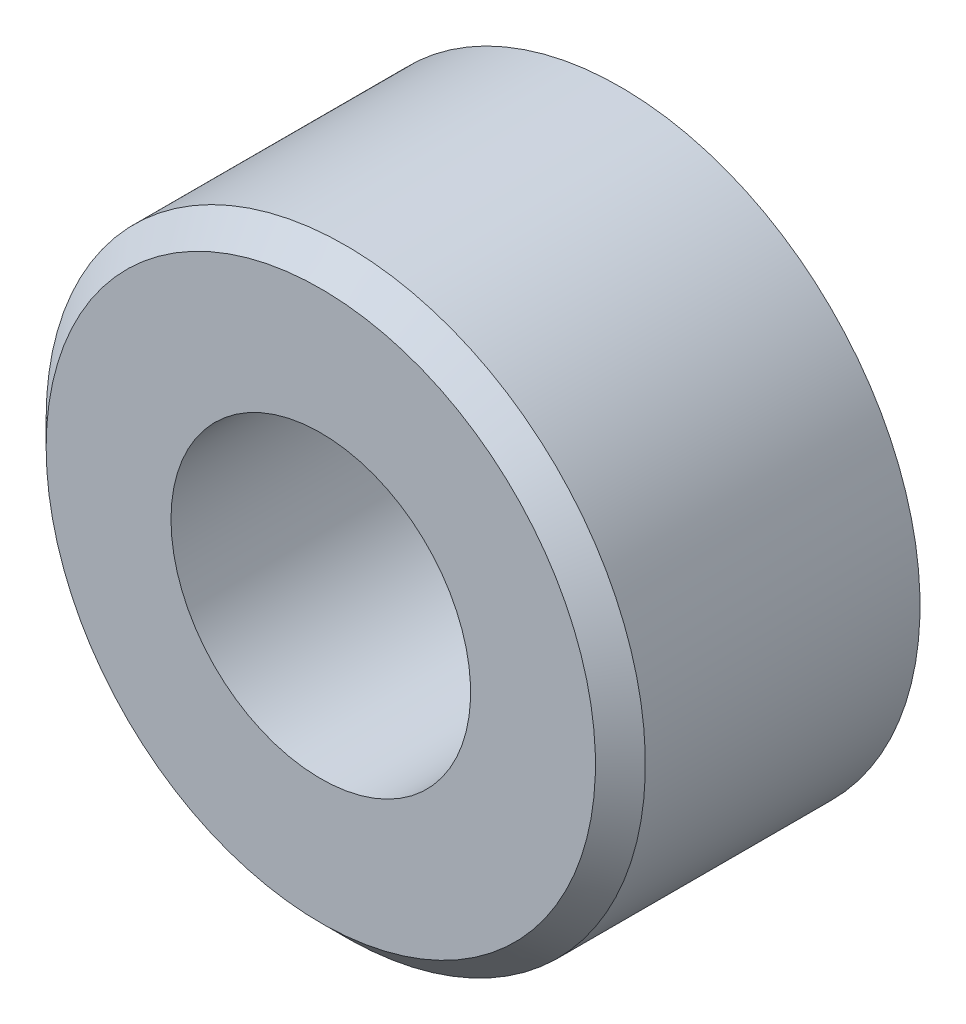
ISO-10303-21;
HEADER;
FILE_DESCRIPTION(('STEP AP214'),'2;1');
FILE_NAME('part.step','',(''),(''),'','','');
FILE_SCHEMA(('AUTOMOTIVE_DESIGN { 1 0 10303 214 1 1 1 1 }'));
ENDSEC;
DATA;
#1=APPLICATION_CONTEXT('core data for automotive mechanical design processes');
#2=APPLICATION_PROTOCOL_DEFINITION('international standard','automotive_design',2000,#1);
#3=PRODUCT_CONTEXT('',#1,'mechanical');
#4=PRODUCT('Part','Part','',(#3));
#5=PRODUCT_RELATED_PRODUCT_CATEGORY('part','',(#4));
#6=PRODUCT_DEFINITION_FORMATION('','',#4);
#7=PRODUCT_DEFINITION_CONTEXT('part definition',#1,'design');
#8=PRODUCT_DEFINITION('design','',#6,#7);
#9=PRODUCT_DEFINITION_SHAPE('','',#8);
#10=(LENGTH_UNIT() NAMED_UNIT(*) SI_UNIT(.MILLI.,.METRE.));
#11=(NAMED_UNIT(*) PLANE_ANGLE_UNIT() SI_UNIT($,.RADIAN.));
#12=(NAMED_UNIT(*) SI_UNIT($,.STERADIAN.) SOLID_ANGLE_UNIT());
#13=UNCERTAINTY_MEASURE_WITH_UNIT(LENGTH_MEASURE(1.E-05),#10,'distance_accuracy_value','');
#14=(GEOMETRIC_REPRESENTATION_CONTEXT(3) GLOBAL_UNCERTAINTY_ASSIGNED_CONTEXT((#13)) GLOBAL_UNIT_ASSIGNED_CONTEXT((#10,
#11,#12)) REPRESENTATION_CONTEXT('',''));
#15=CARTESIAN_POINT('',(0.,0.,0.));
#16=DIRECTION('',(0.,0.,1.));
#17=DIRECTION('',(1.,0.,0.));
#18=AXIS2_PLACEMENT_3D('',#15,#16,#17);
#19=CARTESIAN_POINT('',(5.5,0.,6.));
#20=DIRECTION('',(0.,0.,1.));
#21=DIRECTION('',(1.,0.,0.));
#22=AXIS2_PLACEMENT_3D('',#19,#20,#21);
#23=PLANE('',#22);
#24=CARTESIAN_POINT('',(0.,0.,6.));
#25=DIRECTION('',(0.,0.,-1.));
#26=DIRECTION('',(-1.,0.,0.));
#27=AXIS2_PLACEMENT_3D('',#24,#25,#26);
#28=CIRCLE('',#27,3.);
#29=CARTESIAN_POINT('',(-3.,0.,6.));
#30=VERTEX_POINT('',#29);
#31=EDGE_CURVE('E10',#30,#30,#28,.T.);
#32=ORIENTED_EDGE('',*,*,#31,.T.);
#33=EDGE_LOOP('',(#32));
#34=FACE_BOUND('',#33,.T.);
#35=CARTESIAN_POINT('',(0.,0.,6.));
#36=DIRECTION('',(0.,0.,-1.));
#37=DIRECTION('',(-1.,0.,0.));
#38=AXIS2_PLACEMENT_3D('',#35,#36,#37);
#39=CIRCLE('',#38,5.5);
#40=CARTESIAN_POINT('',(-5.5,0.,6.));
#41=VERTEX_POINT('',#40);
#42=EDGE_CURVE('E52',#41,#41,#39,.T.);
#43=ORIENTED_EDGE('',*,*,#42,.F.);
#44=EDGE_LOOP('',(#43));
#45=FACE_BOUND('',#44,.T.);
#46=ADVANCED_FACE('F33',(#34,#45),#23,.T.);
#47=CARTESIAN_POINT('',(0.,0.,6.));
#48=DIRECTION('',(0.,0.,-1.));
#49=DIRECTION('',(-1.,0.,0.));
#50=AXIS2_PLACEMENT_3D('',#47,#48,#49);
#51=CYLINDRICAL_SURFACE('',#50,3.);
#52=CARTESIAN_POINT('',(0.,0.,0.));
#53=DIRECTION('',(0.,0.,-1.));
#54=DIRECTION('',(-1.,0.,0.));
#55=AXIS2_PLACEMENT_3D('',#52,#53,#54);
#56=CIRCLE('',#55,3.);
#57=CARTESIAN_POINT('',(-3.,0.,0.));
#58=VERTEX_POINT('',#57);
#59=EDGE_CURVE('E39',#58,#58,#56,.T.);
#60=ORIENTED_EDGE('',*,*,#59,.T.);
#61=EDGE_LOOP('',(#60));
#62=FACE_BOUND('',#61,.T.);
#63=ORIENTED_EDGE('',*,*,#31,.F.);
#64=EDGE_LOOP('',(#63));
#65=FACE_BOUND('',#64,.T.);
#66=ADVANCED_FACE('F60',(#62,#65),#51,.F.);
#67=CARTESIAN_POINT('',(3.,0.,0.));
#68=DIRECTION('',(0.,0.,-1.));
#69=DIRECTION('',(-1.,0.,0.));
#70=AXIS2_PLACEMENT_3D('',#67,#68,#69);
#71=PLANE('',#70);
#72=CARTESIAN_POINT('',(0.,0.,0.));
#73=DIRECTION('',(0.,0.,-1.));
#74=DIRECTION('',(-1.,0.,0.));
#75=AXIS2_PLACEMENT_3D('',#72,#73,#74);
#76=CIRCLE('',#75,6.);
#77=CARTESIAN_POINT('',(-6.,0.,0.));
#78=VERTEX_POINT('',#77);
#79=EDGE_CURVE('E43',#78,#78,#76,.T.);
#80=ORIENTED_EDGE('',*,*,#79,.T.);
#81=EDGE_LOOP('',(#80));
#82=FACE_BOUND('',#81,.T.);
#83=ORIENTED_EDGE('',*,*,#59,.F.);
#84=EDGE_LOOP('',(#83));
#85=FACE_BOUND('',#84,.T.);
#86=ADVANCED_FACE('F64',(#82,#85),#71,.T.);
#87=CARTESIAN_POINT('',(0.,0.,6.));
#88=DIRECTION('',(0.,0.,-1.));
#89=DIRECTION('',(-1.,0.,0.));
#90=AXIS2_PLACEMENT_3D('',#87,#88,#89);
#91=CYLINDRICAL_SURFACE('',#90,6.);
#92=CARTESIAN_POINT('',(0.,0.,5.49999999999999));
#93=DIRECTION('',(0.,0.,-1.));
#94=DIRECTION('',(-1.,0.,0.));
#95=AXIS2_PLACEMENT_3D('',#92,#93,#94);
#96=CIRCLE('',#95,6.);
#97=CARTESIAN_POINT('',(-6.,0.,5.49999999999999));
#98=VERTEX_POINT('',#97);
#99=EDGE_CURVE('E47',#98,#98,#96,.T.);
#100=ORIENTED_EDGE('',*,*,#99,.T.);
#101=EDGE_LOOP('',(#100));
#102=FACE_BOUND('',#101,.T.);
#103=ORIENTED_EDGE('',*,*,#79,.F.);
#104=EDGE_LOOP('',(#103));
#105=FACE_BOUND('',#104,.T.);
#106=ADVANCED_FACE('F68',(#102,#105),#91,.T.);
#107=CARTESIAN_POINT('',(0.,0.,5.49999999999999));
#108=DIRECTION('',(0.,0.,-1.));
#109=DIRECTION('',(-1.,0.,0.));
#110=AXIS2_PLACEMENT_3D('',#107,#108,#109);
#111=CONICAL_SURFACE('',#110,6.,0.785398163397447);
#112=ORIENTED_EDGE('',*,*,#42,.T.);
#113=EDGE_LOOP('',(#112));
#114=FACE_BOUND('',#113,.T.);
#115=ORIENTED_EDGE('',*,*,#99,.F.);
#116=EDGE_LOOP('',(#115));
#117=FACE_BOUND('',#116,.T.);
#118=ADVANCED_FACE('F56',(#114,#117),#111,.T.);
#119=CLOSED_SHELL('',(#46,#66,#86,#106,#118));
#120=MANIFOLD_SOLID_BREP('B2',#119);
#121=ADVANCED_BREP_SHAPE_REPRESENTATION('',(#18,#120),#14);
#122=SHAPE_DEFINITION_REPRESENTATION(#9,#121);
ENDSEC;
END-ISO-10303-21;
